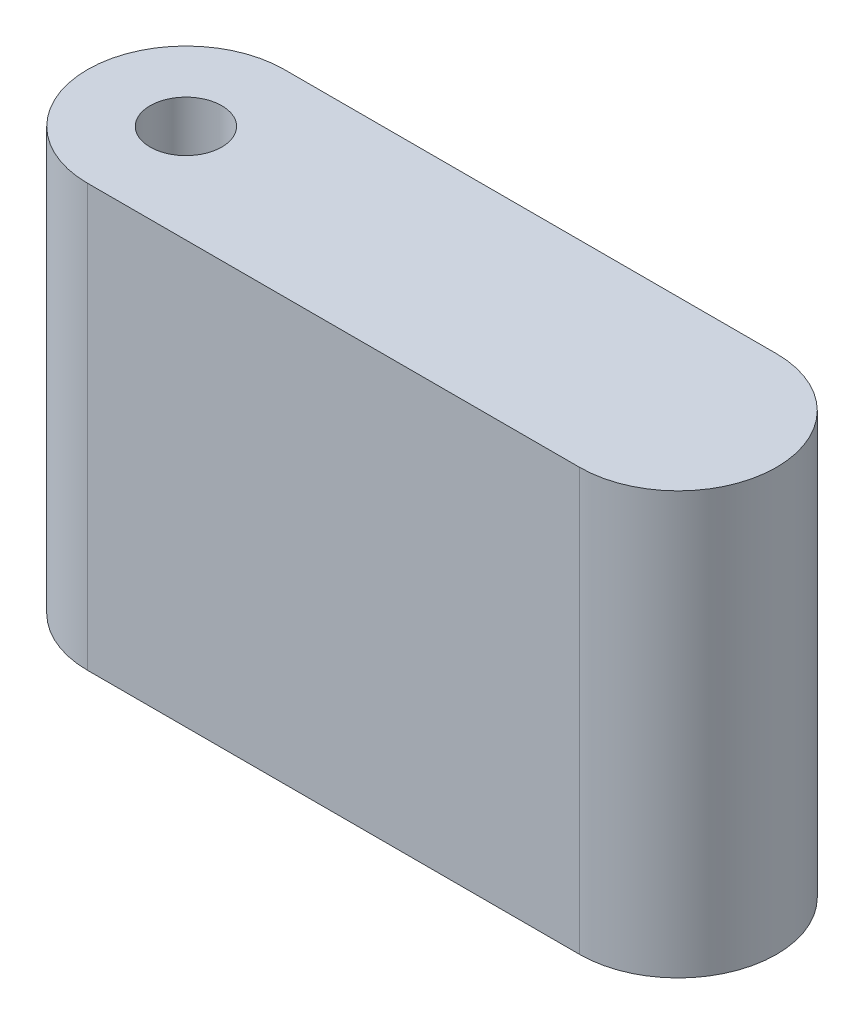
ISO-10303-21;
HEADER;
FILE_DESCRIPTION(('STEP AP214'),'2;1');
FILE_NAME('part.step','',(''),(''),'','','');
FILE_SCHEMA(('AUTOMOTIVE_DESIGN { 1 0 10303 214 1 1 1 1 }'));
ENDSEC;
DATA;
#1=APPLICATION_CONTEXT('core data for automotive mechanical design processes');
#2=APPLICATION_PROTOCOL_DEFINITION('international standard','automotive_design',2000,#1);
#3=PRODUCT_CONTEXT('',#1,'mechanical');
#4=PRODUCT('Part','Part','',(#3));
#5=PRODUCT_RELATED_PRODUCT_CATEGORY('part','',(#4));
#6=PRODUCT_DEFINITION_FORMATION('','',#4);
#7=PRODUCT_DEFINITION_CONTEXT('part definition',#1,'design');
#8=PRODUCT_DEFINITION('design','',#6,#7);
#9=PRODUCT_DEFINITION_SHAPE('','',#8);
#10=(LENGTH_UNIT() NAMED_UNIT(*) SI_UNIT(.MILLI.,.METRE.));
#11=(NAMED_UNIT(*) PLANE_ANGLE_UNIT() SI_UNIT($,.RADIAN.));
#12=(NAMED_UNIT(*) SI_UNIT($,.STERADIAN.) SOLID_ANGLE_UNIT());
#13=UNCERTAINTY_MEASURE_WITH_UNIT(LENGTH_MEASURE(1.E-05),#10,'distance_accuracy_value','');
#14=(GEOMETRIC_REPRESENTATION_CONTEXT(3) GLOBAL_UNCERTAINTY_ASSIGNED_CONTEXT((#13)) GLOBAL_UNIT_ASSIGNED_CONTEXT((#10,
#11,#12)) REPRESENTATION_CONTEXT('',''));
#15=CARTESIAN_POINT('',(0.,0.,0.));
#16=DIRECTION('',(0.,0.,1.));
#17=DIRECTION('',(1.,0.,0.));
#18=AXIS2_PLACEMENT_3D('',#15,#16,#17);
#19=CARTESIAN_POINT('',(0.,-15.,0.));
#20=DIRECTION('',(0.,1.,0.));
#21=DIRECTION('',(0.,0.,1.));
#22=AXIS2_PLACEMENT_3D('',#19,#20,#21);
#23=CYLINDRICAL_SURFACE('',#22,7.);
#24=DIRECTION('',(0.,1.,0.));
#25=VECTOR('',#24,1.);
#26=CARTESIAN_POINT('',(0.,-15.,7.));
#27=LINE('',#26,#25);
#28=CARTESIAN_POINT('',(0.,-15.,7.));
#29=VERTEX_POINT('',#28);
#30=CARTESIAN_POINT('',(0.,15.,7.));
#31=VERTEX_POINT('',#30);
#32=EDGE_CURVE('E36',#29,#31,#27,.T.);
#33=ORIENTED_EDGE('',*,*,#32,.T.);
#34=CARTESIAN_POINT('',(0.,15.,0.));
#35=DIRECTION('',(0.,1.,0.));
#36=DIRECTION('',(0.,0.,1.));
#37=AXIS2_PLACEMENT_3D('',#34,#35,#36);
#38=CIRCLE('',#37,7.);
#39=CARTESIAN_POINT('',(0.,15.,-7.));
#40=VERTEX_POINT('',#39);
#41=EDGE_CURVE('E73',#40,#31,#38,.T.);
#42=ORIENTED_EDGE('',*,*,#41,.F.);
#43=DIRECTION('',(0.,1.,0.));
#44=VECTOR('',#43,1.);
#45=CARTESIAN_POINT('',(0.,-15.,-7.));
#46=LINE('',#45,#44);
#47=CARTESIAN_POINT('',(0.,-15.,-7.));
#48=VERTEX_POINT('',#47);
#49=EDGE_CURVE('E11',#48,#40,#46,.T.);
#50=ORIENTED_EDGE('',*,*,#49,.F.);
#51=CARTESIAN_POINT('',(0.,-15.,0.));
#52=DIRECTION('',(0.,1.,0.));
#53=DIRECTION('',(0.,0.,1.));
#54=AXIS2_PLACEMENT_3D('',#51,#52,#53);
#55=CIRCLE('',#54,7.);
#56=EDGE_CURVE('E74',#48,#29,#55,.T.);
#57=ORIENTED_EDGE('',*,*,#56,.T.);
#58=EDGE_LOOP('',(#33,#42,#50,#57));
#59=FACE_BOUND('',#58,.T.);
#60=ADVANCED_FACE('F33',(#59),#23,.T.);
#61=CARTESIAN_POINT('',(0.,-15.,-7.));
#62=DIRECTION('',(0.,0.,-1.));
#63=DIRECTION('',(-1.,0.,0.));
#64=AXIS2_PLACEMENT_3D('',#61,#62,#63);
#65=PLANE('',#64);
#66=ORIENTED_EDGE('',*,*,#49,.T.);
#67=DIRECTION('',(-1.,0.,0.));
#68=VECTOR('',#67,1.);
#69=CARTESIAN_POINT('',(0.,15.,-7.));
#70=LINE('',#69,#68);
#71=CARTESIAN_POINT('',(35.,15.,-7.));
#72=VERTEX_POINT('',#71);
#73=EDGE_CURVE('E91',#72,#40,#70,.T.);
#74=ORIENTED_EDGE('',*,*,#73,.F.);
#75=DIRECTION('',(0.,1.,0.));
#76=VECTOR('',#75,1.);
#77=CARTESIAN_POINT('',(35.,-15.,-7.));
#78=LINE('',#77,#76);
#79=CARTESIAN_POINT('',(35.,-15.,-7.));
#80=VERTEX_POINT('',#79);
#81=EDGE_CURVE('E41',#80,#72,#78,.T.);
#82=ORIENTED_EDGE('',*,*,#81,.F.);
#83=DIRECTION('',(-1.,0.,0.));
#84=VECTOR('',#83,1.);
#85=CARTESIAN_POINT('',(0.,-15.,-7.));
#86=LINE('',#85,#84);
#87=EDGE_CURVE('E79',#80,#48,#86,.T.);
#88=ORIENTED_EDGE('',*,*,#87,.T.);
#89=EDGE_LOOP('',(#66,#74,#82,#88));
#90=FACE_BOUND('',#89,.T.);
#91=ADVANCED_FACE('F112',(#90),#65,.T.);
#92=CARTESIAN_POINT('',(35.,-15.,0.));
#93=DIRECTION('',(0.,1.,0.));
#94=DIRECTION('',(0.,0.,1.));
#95=AXIS2_PLACEMENT_3D('',#92,#93,#94);
#96=CYLINDRICAL_SURFACE('',#95,7.);
#97=ORIENTED_EDGE('',*,*,#81,.T.);
#98=CARTESIAN_POINT('',(35.,15.,0.));
#99=DIRECTION('',(0.,1.,0.));
#100=DIRECTION('',(0.,0.,1.));
#101=AXIS2_PLACEMENT_3D('',#98,#99,#100);
#102=CIRCLE('',#101,7.);
#103=CARTESIAN_POINT('',(35.,15.,7.));
#104=VERTEX_POINT('',#103);
#105=EDGE_CURVE('E86',#104,#72,#102,.T.);
#106=ORIENTED_EDGE('',*,*,#105,.F.);
#107=DIRECTION('',(0.,1.,0.));
#108=VECTOR('',#107,1.);
#109=CARTESIAN_POINT('',(35.,-15.,7.));
#110=LINE('',#109,#108);
#111=CARTESIAN_POINT('',(35.,-15.,7.));
#112=VERTEX_POINT('',#111);
#113=EDGE_CURVE('E78',#112,#104,#110,.T.);
#114=ORIENTED_EDGE('',*,*,#113,.F.);
#115=CARTESIAN_POINT('',(35.,-15.,0.));
#116=DIRECTION('',(0.,1.,0.));
#117=DIRECTION('',(0.,0.,1.));
#118=AXIS2_PLACEMENT_3D('',#115,#116,#117);
#119=CIRCLE('',#118,7.);
#120=EDGE_CURVE('E105',#112,#80,#119,.T.);
#121=ORIENTED_EDGE('',*,*,#120,.T.);
#122=EDGE_LOOP('',(#97,#106,#114,#121));
#123=FACE_BOUND('',#122,.T.);
#124=ADVANCED_FACE('F109',(#123),#96,.T.);
#125=CARTESIAN_POINT('',(0.,-15.,7.));
#126=DIRECTION('',(0.,0.,1.));
#127=DIRECTION('',(1.,0.,0.));
#128=AXIS2_PLACEMENT_3D('',#125,#126,#127);
#129=PLANE('',#128);
#130=ORIENTED_EDGE('',*,*,#113,.T.);
#131=DIRECTION('',(1.,0.,0.));
#132=VECTOR('',#131,1.);
#133=CARTESIAN_POINT('',(0.,15.,7.));
#134=LINE('',#133,#132);
#135=EDGE_CURVE('E81',#31,#104,#134,.T.);
#136=ORIENTED_EDGE('',*,*,#135,.F.);
#137=ORIENTED_EDGE('',*,*,#32,.F.);
#138=DIRECTION('',(1.,0.,0.));
#139=VECTOR('',#138,1.);
#140=CARTESIAN_POINT('',(0.,-15.,7.));
#141=LINE('',#140,#139);
#142=EDGE_CURVE('E103',#29,#112,#141,.T.);
#143=ORIENTED_EDGE('',*,*,#142,.T.);
#144=EDGE_LOOP('',(#130,#136,#137,#143));
#145=FACE_BOUND('',#144,.T.);
#146=ADVANCED_FACE('F82',(#145),#129,.T.);
#147=CARTESIAN_POINT('',(0.,-15.,0.));
#148=DIRECTION('',(0.,1.,0.));
#149=DIRECTION('',(0.,0.,1.));
#150=AXIS2_PLACEMENT_3D('',#147,#148,#149);
#151=PLANE('',#150);
#152=CARTESIAN_POINT('',(0.,-15.,0.));
#153=DIRECTION('',(0.,1.,0.));
#154=DIRECTION('',(0.,0.,1.));
#155=AXIS2_PLACEMENT_3D('',#152,#153,#154);
#156=CIRCLE('',#155,2.55);
#157=CARTESIAN_POINT('',(0.,-15.,2.55));
#158=VERTEX_POINT('',#157);
#159=EDGE_CURVE('E99',#158,#158,#156,.T.);
#160=ORIENTED_EDGE('',*,*,#159,.T.);
#161=EDGE_LOOP('',(#160));
#162=FACE_BOUND('',#161,.T.);
#163=ORIENTED_EDGE('',*,*,#56,.F.);
#164=ORIENTED_EDGE('',*,*,#87,.F.);
#165=ORIENTED_EDGE('',*,*,#120,.F.);
#166=ORIENTED_EDGE('',*,*,#142,.F.);
#167=EDGE_LOOP('',(#163,#164,#165,#166));
#168=FACE_BOUND('',#167,.T.);
#169=ADVANCED_FACE('F114',(#162,#168),#151,.F.);
#170=CARTESIAN_POINT('',(0.,-15.,0.));
#171=DIRECTION('',(0.,1.,0.));
#172=DIRECTION('',(0.,0.,1.));
#173=AXIS2_PLACEMENT_3D('',#170,#171,#172);
#174=CYLINDRICAL_SURFACE('',#173,2.55);
#175=ORIENTED_EDGE('',*,*,#159,.F.);
#176=EDGE_LOOP('',(#175));
#177=FACE_BOUND('',#176,.T.);
#178=CARTESIAN_POINT('',(0.,15.,0.));
#179=DIRECTION('',(0.,1.,0.));
#180=DIRECTION('',(0.,0.,1.));
#181=AXIS2_PLACEMENT_3D('',#178,#179,#180);
#182=CIRCLE('',#181,2.55);
#183=CARTESIAN_POINT('',(0.,15.,2.55));
#184=VERTEX_POINT('',#183);
#185=EDGE_CURVE('E92',#184,#184,#182,.T.);
#186=ORIENTED_EDGE('',*,*,#185,.T.);
#187=EDGE_LOOP('',(#186));
#188=FACE_BOUND('',#187,.T.);
#189=ADVANCED_FACE('F116',(#177,#188),#174,.F.);
#190=CARTESIAN_POINT('',(0.,15.,0.));
#191=DIRECTION('',(0.,1.,0.));
#192=DIRECTION('',(0.,0.,1.));
#193=AXIS2_PLACEMENT_3D('',#190,#191,#192);
#194=PLANE('',#193);
#195=ORIENTED_EDGE('',*,*,#41,.T.);
#196=ORIENTED_EDGE('',*,*,#135,.T.);
#197=ORIENTED_EDGE('',*,*,#105,.T.);
#198=ORIENTED_EDGE('',*,*,#73,.T.);
#199=EDGE_LOOP('',(#195,#196,#197,#198));
#200=FACE_BOUND('',#199,.T.);
#201=ORIENTED_EDGE('',*,*,#185,.F.);
#202=EDGE_LOOP('',(#201));
#203=FACE_BOUND('',#202,.T.);
#204=ADVANCED_FACE('F89',(#200,#203),#194,.T.);
#205=CLOSED_SHELL('',(#60,#91,#124,#146,#169,#189,#204));
#206=MANIFOLD_SOLID_BREP('B2',#205);
#207=ADVANCED_BREP_SHAPE_REPRESENTATION('',(#18,#206),#14);
#208=SHAPE_DEFINITION_REPRESENTATION(#9,#207);
ENDSEC;
END-ISO-10303-21;
